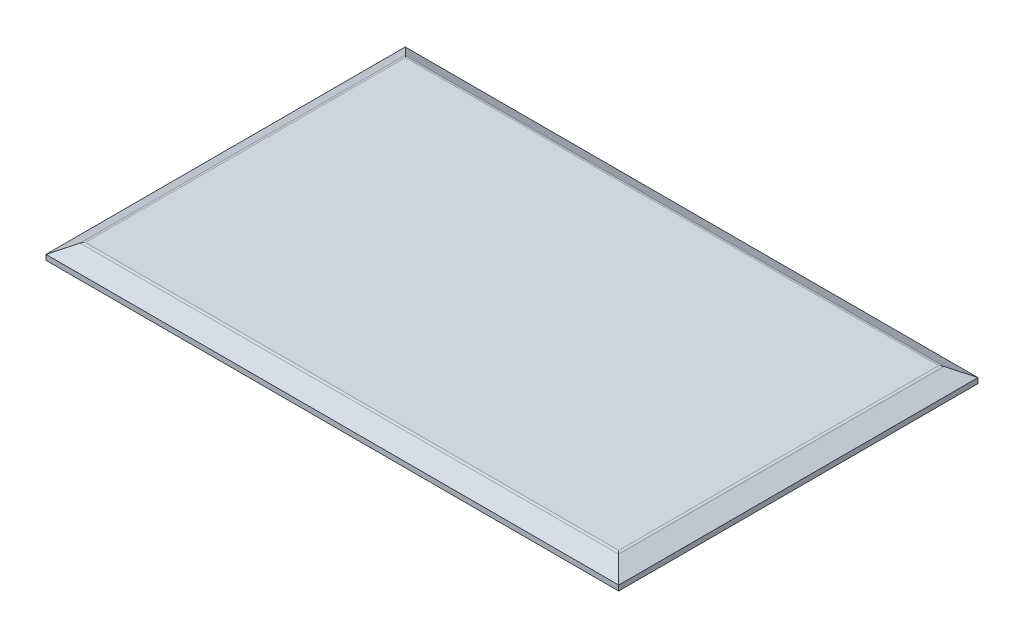
ISO-10303-21;
HEADER;
FILE_DESCRIPTION(('STEP AP214'),'2;1');
FILE_NAME('part.step','',(''),(''),'','','');
FILE_SCHEMA(('AUTOMOTIVE_DESIGN { 1 0 10303 214 1 1 1 1 }'));
ENDSEC;
DATA;
#1=APPLICATION_CONTEXT('core data for automotive mechanical design processes');
#2=APPLICATION_PROTOCOL_DEFINITION('international standard','automotive_design',2000,#1);
#3=PRODUCT_CONTEXT('',#1,'mechanical');
#4=PRODUCT('Part','Part','',(#3));
#5=PRODUCT_RELATED_PRODUCT_CATEGORY('part','',(#4));
#6=PRODUCT_DEFINITION_FORMATION('','',#4);
#7=PRODUCT_DEFINITION_CONTEXT('part definition',#1,'design');
#8=PRODUCT_DEFINITION('design','',#6,#7);
#9=PRODUCT_DEFINITION_SHAPE('','',#8);
#10=(LENGTH_UNIT() NAMED_UNIT(*) SI_UNIT(.MILLI.,.METRE.));
#11=(NAMED_UNIT(*) PLANE_ANGLE_UNIT() SI_UNIT($,.RADIAN.));
#12=(NAMED_UNIT(*) SI_UNIT($,.STERADIAN.) SOLID_ANGLE_UNIT());
#13=UNCERTAINTY_MEASURE_WITH_UNIT(LENGTH_MEASURE(1.E-05),#10,'distance_accuracy_value','');
#14=(GEOMETRIC_REPRESENTATION_CONTEXT(3) GLOBAL_UNCERTAINTY_ASSIGNED_CONTEXT((#13)) GLOBAL_UNIT_ASSIGNED_CONTEXT((#10,
#11,#12)) REPRESENTATION_CONTEXT('',''));
#15=CARTESIAN_POINT('',(0.,0.,0.));
#16=DIRECTION('',(0.,0.,1.));
#17=DIRECTION('',(1.,0.,0.));
#18=AXIS2_PLACEMENT_3D('',#15,#16,#17);
#19=CARTESIAN_POINT('',(55.,3.,-34.5));
#20=DIRECTION('',(-1.,0.,0.));
#21=DIRECTION('',(0.,0.,1.));
#22=AXIS2_PLACEMENT_3D('',#19,#20,#21);
#23=PLANE('',#22);
#24=DIRECTION('',(0.,-1.,0.));
#25=VECTOR('',#24,1.);
#26=CARTESIAN_POINT('',(55.,3.,-34.5));
#27=LINE('',#26,#25);
#28=CARTESIAN_POINT('',(55.,0.999999999999999,-34.5));
#29=VERTEX_POINT('',#28);
#30=CARTESIAN_POINT('',(55.,0.,-34.5));
#31=VERTEX_POINT('',#30);
#32=EDGE_CURVE('E106',#29,#31,#27,.T.);
#33=ORIENTED_EDGE('',*,*,#32,.F.);
#34=DIRECTION('',(0.,0.,1.));
#35=VECTOR('',#34,1.);
#36=CARTESIAN_POINT('',(55.,0.999999999999999,34.5));
#37=LINE('',#36,#35);
#38=CARTESIAN_POINT('',(55.,0.999999999999999,34.5));
#39=VERTEX_POINT('',#38);
#40=EDGE_CURVE('E152',#29,#39,#37,.T.);
#41=ORIENTED_EDGE('',*,*,#40,.T.);
#42=DIRECTION('',(0.,-1.,0.));
#43=VECTOR('',#42,1.);
#44=CARTESIAN_POINT('',(55.,3.,34.5));
#45=LINE('',#44,#43);
#46=CARTESIAN_POINT('',(55.,0.,34.5));
#47=VERTEX_POINT('',#46);
#48=EDGE_CURVE('E129',#39,#47,#45,.T.);
#49=ORIENTED_EDGE('',*,*,#48,.T.);
#50=DIRECTION('',(0.,0.,-1.));
#51=VECTOR('',#50,1.);
#52=CARTESIAN_POINT('',(55.,0.,-34.5));
#53=LINE('',#52,#51);
#54=EDGE_CURVE('E124',#47,#31,#53,.T.);
#55=ORIENTED_EDGE('',*,*,#54,.T.);
#56=EDGE_LOOP('',(#33,#41,#49,#55));
#57=FACE_BOUND('',#56,.T.);
#58=ADVANCED_FACE('F39',(#57),#23,.F.);
#59=CARTESIAN_POINT('',(-55.,3.,-34.5));
#60=DIRECTION('',(0.,0.,1.));
#61=DIRECTION('',(1.,0.,0.));
#62=AXIS2_PLACEMENT_3D('',#59,#60,#61);
#63=PLANE('',#62);
#64=DIRECTION('',(0.,-1.,0.));
#65=VECTOR('',#64,1.);
#66=CARTESIAN_POINT('',(-55.,3.,-34.5));
#67=LINE('',#66,#65);
#68=CARTESIAN_POINT('',(-55.,0.999999999999998,-34.5));
#69=VERTEX_POINT('',#68);
#70=CARTESIAN_POINT('',(-55.,0.,-34.5));
#71=VERTEX_POINT('',#70);
#72=EDGE_CURVE('E118',#69,#71,#67,.T.);
#73=ORIENTED_EDGE('',*,*,#72,.F.);
#74=DIRECTION('',(1.,0.,0.));
#75=VECTOR('',#74,1.);
#76=CARTESIAN_POINT('',(55.,0.999999999999998,-34.5));
#77=LINE('',#76,#75);
#78=EDGE_CURVE('E113',#69,#29,#77,.T.);
#79=ORIENTED_EDGE('',*,*,#78,.T.);
#80=ORIENTED_EDGE('',*,*,#32,.T.);
#81=DIRECTION('',(-1.,0.,0.));
#82=VECTOR('',#81,1.);
#83=CARTESIAN_POINT('',(-55.,0.,-34.5));
#84=LINE('',#83,#82);
#85=EDGE_CURVE('E110',#31,#71,#84,.T.);
#86=ORIENTED_EDGE('',*,*,#85,.T.);
#87=EDGE_LOOP('',(#73,#79,#80,#86));
#88=FACE_BOUND('',#87,.T.);
#89=ADVANCED_FACE('F109',(#88),#63,.F.);
#90=CARTESIAN_POINT('',(-55.,3.,-34.5));
#91=DIRECTION('',(1.,0.,0.));
#92=DIRECTION('',(0.,0.,-1.));
#93=AXIS2_PLACEMENT_3D('',#90,#91,#92);
#94=PLANE('',#93);
#95=DIRECTION('',(0.,-1.,0.));
#96=VECTOR('',#95,1.);
#97=CARTESIAN_POINT('',(-55.,3.,34.5));
#98=LINE('',#97,#96);
#99=CARTESIAN_POINT('',(-55.,0.999999999999998,34.5));
#100=VERTEX_POINT('',#99);
#101=CARTESIAN_POINT('',(-55.,0.,34.5));
#102=VERTEX_POINT('',#101);
#103=EDGE_CURVE('E143',#100,#102,#98,.T.);
#104=ORIENTED_EDGE('',*,*,#103,.F.);
#105=DIRECTION('',(0.,0.,-1.));
#106=VECTOR('',#105,1.);
#107=CARTESIAN_POINT('',(-55.,0.999999999999998,-34.5));
#108=LINE('',#107,#106);
#109=EDGE_CURVE('E148',#100,#69,#108,.T.);
#110=ORIENTED_EDGE('',*,*,#109,.T.);
#111=ORIENTED_EDGE('',*,*,#72,.T.);
#112=DIRECTION('',(0.,0.,1.));
#113=VECTOR('',#112,1.);
#114=CARTESIAN_POINT('',(-55.,0.,-34.5));
#115=LINE('',#114,#113);
#116=EDGE_CURVE('E126',#71,#102,#115,.T.);
#117=ORIENTED_EDGE('',*,*,#116,.T.);
#118=EDGE_LOOP('',(#104,#110,#111,#117));
#119=FACE_BOUND('',#118,.T.);
#120=ADVANCED_FACE('F211',(#119),#94,.F.);
#121=CARTESIAN_POINT('',(-55.,3.,34.5));
#122=DIRECTION('',(0.,0.,-1.));
#123=DIRECTION('',(-1.,0.,0.));
#124=AXIS2_PLACEMENT_3D('',#121,#122,#123);
#125=PLANE('',#124);
#126=ORIENTED_EDGE('',*,*,#48,.F.);
#127=DIRECTION('',(-1.,0.,0.));
#128=VECTOR('',#127,1.);
#129=CARTESIAN_POINT('',(-55.,0.999999999999998,34.5));
#130=LINE('',#129,#128);
#131=EDGE_CURVE('E117',#39,#100,#130,.T.);
#132=ORIENTED_EDGE('',*,*,#131,.T.);
#133=ORIENTED_EDGE('',*,*,#103,.T.);
#134=DIRECTION('',(1.,0.,0.));
#135=VECTOR('',#134,1.);
#136=CARTESIAN_POINT('',(-55.,0.,34.5));
#137=LINE('',#136,#135);
#138=EDGE_CURVE('E140',#102,#47,#137,.T.);
#139=ORIENTED_EDGE('',*,*,#138,.T.);
#140=EDGE_LOOP('',(#126,#132,#133,#139));
#141=FACE_BOUND('',#140,.T.);
#142=ADVANCED_FACE('F201',(#141),#125,.F.);
#143=CARTESIAN_POINT('',(0.,3.,0.));
#144=DIRECTION('',(0.,1.,0.));
#145=DIRECTION('',(0.,0.,1.));
#146=AXIS2_PLACEMENT_3D('',#143,#144,#145);
#147=PLANE('',#146);
#148=DIRECTION('',(0.,0.,-1.));
#149=VECTOR('',#148,1.);
#150=CARTESIAN_POINT('',(51.2344355629253,3.,0.));
#151=LINE('',#150,#149);
#152=CARTESIAN_POINT('',(51.2344355629253,3.,30.7344355629253));
#153=VERTEX_POINT('',#152);
#154=CARTESIAN_POINT('',(51.2344355629253,3.,-30.7344355629253));
#155=VERTEX_POINT('',#154);
#156=EDGE_CURVE('E164',#153,#155,#151,.T.);
#157=ORIENTED_EDGE('',*,*,#156,.T.);
#158=DIRECTION('',(-1.,0.,0.));
#159=VECTOR('',#158,1.);
#160=CARTESIAN_POINT('',(0.,3.,-30.7344355629253));
#161=LINE('',#160,#159);
#162=CARTESIAN_POINT('',(-51.2344355629253,3.,-30.7344355629253));
#163=VERTEX_POINT('',#162);
#164=EDGE_CURVE('E166',#155,#163,#161,.T.);
#165=ORIENTED_EDGE('',*,*,#164,.T.);
#166=DIRECTION('',(0.,0.,1.));
#167=VECTOR('',#166,1.);
#168=CARTESIAN_POINT('',(-51.2344355629253,3.,0.));
#169=LINE('',#168,#167);
#170=CARTESIAN_POINT('',(-51.2344355629253,3.,30.7344355629253));
#171=VERTEX_POINT('',#170);
#172=EDGE_CURVE('E154',#163,#171,#169,.T.);
#173=ORIENTED_EDGE('',*,*,#172,.T.);
#174=DIRECTION('',(1.,0.,0.));
#175=VECTOR('',#174,1.);
#176=CARTESIAN_POINT('',(0.,3.,30.7344355629253));
#177=LINE('',#176,#175);
#178=EDGE_CURVE('E162',#171,#153,#177,.T.);
#179=ORIENTED_EDGE('',*,*,#178,.T.);
#180=EDGE_LOOP('',(#157,#165,#173,#179));
#181=FACE_BOUND('',#180,.T.);
#182=ADVANCED_FACE('F191',(#181),#147,.T.);
#183=CARTESIAN_POINT('',(0.,0.,0.));
#184=DIRECTION('',(0.,1.,0.));
#185=DIRECTION('',(0.,0.,1.));
#186=AXIS2_PLACEMENT_3D('',#183,#184,#185);
#187=PLANE('',#186);
#188=CARTESIAN_POINT('',(44.,0.,-3.50000000000001));
#189=DIRECTION('',(0.,1.,0.));
#190=DIRECTION('',(0.,0.,1.));
#191=AXIS2_PLACEMENT_3D('',#188,#189,#190);
#192=CIRCLE('',#191,1.5);
#193=CARTESIAN_POINT('',(44.,0.,-2.00000000000001));
#194=VERTEX_POINT('',#193);
#195=EDGE_CURVE('E11',#194,#194,#192,.F.);
#196=ORIENTED_EDGE('',*,*,#195,.F.);
#197=EDGE_LOOP('',(#196));
#198=FACE_BOUND('',#197,.T.);
#199=CARTESIAN_POINT('',(44.,0.,3.50000000000001));
#200=DIRECTION('',(0.,1.,0.));
#201=DIRECTION('',(0.,0.,1.));
#202=AXIS2_PLACEMENT_3D('',#199,#200,#201);
#203=CIRCLE('',#202,1.5);
#204=CARTESIAN_POINT('',(44.,0.,5.00000000000001));
#205=VERTEX_POINT('',#204);
#206=EDGE_CURVE('E47',#205,#205,#203,.F.);
#207=ORIENTED_EDGE('',*,*,#206,.F.);
#208=EDGE_LOOP('',(#207));
#209=FACE_BOUND('',#208,.T.);
#210=ORIENTED_EDGE('',*,*,#54,.F.);
#211=ORIENTED_EDGE('',*,*,#138,.F.);
#212=ORIENTED_EDGE('',*,*,#116,.F.);
#213=ORIENTED_EDGE('',*,*,#85,.F.);
#214=EDGE_LOOP('',(#210,#211,#212,#213));
#215=FACE_BOUND('',#214,.T.);
#216=ADVANCED_FACE('F122',(#198,#209,#215),#187,.F.);
#217=CARTESIAN_POINT('',(0.,3.,-31.));
#218=DIRECTION('',(0.,0.868243142124461,-0.496138938356831));
#219=DIRECTION('',(1.,0.,0.));
#220=AXIS2_PLACEMENT_3D('',#217,#218,#219);
#221=PLANE('',#220);
#222=DIRECTION('',(0.655610068107187,0.374634324632675,0.655610068107187));
#223=VECTOR('',#222,1.);
#224=CARTESIAN_POINT('',(-29.3640350877192,15.6491228070175,-8.86403508771923));
#225=LINE('',#224,#223);
#226=CARTESIAN_POINT('',(-51.7305745012822,2.86824314212445,-31.2305745012822));
#227=VERTEX_POINT('',#226);
#228=EDGE_CURVE('E131',#227,#69,#225,.F.);
#229=ORIENTED_EDGE('',*,*,#228,.F.);
#230=DIRECTION('',(-1.,0.,0.));
#231=VECTOR('',#230,1.);
#232=CARTESIAN_POINT('',(0.,2.86824314212446,-31.2305745012822));
#233=LINE('',#232,#231);
#234=CARTESIAN_POINT('',(51.7305745012821,2.86824314212446,-31.2305745012822));
#235=VERTEX_POINT('',#234);
#236=EDGE_CURVE('E169',#227,#235,#233,.F.);
#237=ORIENTED_EDGE('',*,*,#236,.T.);
#238=DIRECTION('',(-0.655610068107187,0.374634324632675,0.655610068107186));
#239=VECTOR('',#238,1.);
#240=CARTESIAN_POINT('',(38.1754385964912,10.6140350877192,-17.6754385964912));
#241=LINE('',#240,#239);
#242=EDGE_CURVE('E133',#29,#235,#241,.T.);
#243=ORIENTED_EDGE('',*,*,#242,.F.);
#244=ORIENTED_EDGE('',*,*,#78,.F.);
#245=EDGE_LOOP('',(#229,#237,#243,#244));
#246=FACE_BOUND('',#245,.T.);
#247=ADVANCED_FACE('F190',(#246),#221,.T.);
#248=CARTESIAN_POINT('',(-51.5,3.,0.));
#249=DIRECTION('',(-0.496138938356831,0.868243142124461,0.));
#250=DIRECTION('',(0.,0.,-1.));
#251=AXIS2_PLACEMENT_3D('',#248,#249,#250);
#252=PLANE('',#251);
#253=DIRECTION('',(0.655610068107187,0.374634324632675,-0.655610068107187));
#254=VECTOR('',#253,1.);
#255=CARTESIAN_POINT('',(-38.1754385964912,10.6140350877192,17.6754385964912));
#256=LINE('',#255,#254);
#257=CARTESIAN_POINT('',(-51.7305745012822,2.86824314212446,31.2305745012822));
#258=VERTEX_POINT('',#257);
#259=EDGE_CURVE('E157',#258,#100,#256,.F.);
#260=ORIENTED_EDGE('',*,*,#259,.F.);
#261=DIRECTION('',(0.,0.,1.));
#262=VECTOR('',#261,1.);
#263=CARTESIAN_POINT('',(-51.7305745012822,2.86824314212446,0.));
#264=LINE('',#263,#262);
#265=EDGE_CURVE('E174',#258,#227,#264,.F.);
#266=ORIENTED_EDGE('',*,*,#265,.T.);
#267=ORIENTED_EDGE('',*,*,#228,.T.);
#268=ORIENTED_EDGE('',*,*,#109,.F.);
#269=EDGE_LOOP('',(#260,#266,#267,#268));
#270=FACE_BOUND('',#269,.T.);
#271=ADVANCED_FACE('F198',(#270),#252,.T.);
#272=CARTESIAN_POINT('',(51.5,3.,0.));
#273=DIRECTION('',(0.49613893835683,0.868243142124461,0.));
#274=DIRECTION('',(0.,0.,1.));
#275=AXIS2_PLACEMENT_3D('',#272,#273,#274);
#276=PLANE('',#275);
#277=ORIENTED_EDGE('',*,*,#242,.T.);
#278=DIRECTION('',(0.,0.,-1.));
#279=VECTOR('',#278,1.);
#280=CARTESIAN_POINT('',(51.7305745012822,2.86824314212446,0.));
#281=LINE('',#280,#279);
#282=CARTESIAN_POINT('',(51.7305745012822,2.86824314212446,31.2305745012822));
#283=VERTEX_POINT('',#282);
#284=EDGE_CURVE('E62',#235,#283,#281,.F.);
#285=ORIENTED_EDGE('',*,*,#284,.T.);
#286=DIRECTION('',(0.655610068107187,-0.374634324632675,0.655610068107186));
#287=VECTOR('',#286,1.);
#288=CARTESIAN_POINT('',(38.1754385964912,10.6140350877192,17.6754385964912));
#289=LINE('',#288,#287);
#290=EDGE_CURVE('E155',#39,#283,#289,.F.);
#291=ORIENTED_EDGE('',*,*,#290,.F.);
#292=ORIENTED_EDGE('',*,*,#40,.F.);
#293=EDGE_LOOP('',(#277,#285,#291,#292));
#294=FACE_BOUND('',#293,.T.);
#295=ADVANCED_FACE('F218',(#294),#276,.T.);
#296=CARTESIAN_POINT('',(0.,3.,31.));
#297=DIRECTION('',(0.,0.868243142124461,0.496138938356831));
#298=DIRECTION('',(-1.,0.,0.));
#299=AXIS2_PLACEMENT_3D('',#296,#297,#298);
#300=PLANE('',#299);
#301=ORIENTED_EDGE('',*,*,#290,.T.);
#302=DIRECTION('',(1.,0.,0.));
#303=VECTOR('',#302,1.);
#304=CARTESIAN_POINT('',(0.,2.86824314212446,31.2305745012822));
#305=LINE('',#304,#303);
#306=EDGE_CURVE('E54',#283,#258,#305,.F.);
#307=ORIENTED_EDGE('',*,*,#306,.T.);
#308=ORIENTED_EDGE('',*,*,#259,.T.);
#309=ORIENTED_EDGE('',*,*,#131,.F.);
#310=EDGE_LOOP('',(#301,#307,#308,#309));
#311=FACE_BOUND('',#310,.T.);
#312=ADVANCED_FACE('F215',(#311),#300,.T.);
#313=CARTESIAN_POINT('',(0.,2.,30.7344355629253));
#314=DIRECTION('',(1.,0.,0.));
#315=DIRECTION('',(0.,0.,-1.));
#316=AXIS2_PLACEMENT_3D('',#313,#314,#315);
#317=CYLINDRICAL_SURFACE('',#316,1.);
#318=CARTESIAN_POINT('',(-51.2344355629253,2.,30.7344355629253));
#319=DIRECTION('',(0.707106781186547,0.,0.707106781186547));
#320=DIRECTION('',(-0.707106781186547,0.,0.707106781186547));
#321=AXIS2_PLACEMENT_3D('',#318,#319,#320);
#322=ELLIPSE('',#321,1.41421356237309,1.);
#323=EDGE_CURVE('E180',#258,#171,#322,.F.);
#324=ORIENTED_EDGE('',*,*,#323,.F.);
#325=ORIENTED_EDGE('',*,*,#306,.F.);
#326=CARTESIAN_POINT('',(51.2344355629253,2.,30.7344355629253));
#327=DIRECTION('',(0.707106781186547,0.,-0.707106781186548));
#328=DIRECTION('',(0.707106781186547,0.,0.707106781186547));
#329=AXIS2_PLACEMENT_3D('',#326,#327,#328);
#330=ELLIPSE('',#329,1.4142135623731,1.);
#331=EDGE_CURVE('E158',#153,#283,#330,.T.);
#332=ORIENTED_EDGE('',*,*,#331,.F.);
#333=ORIENTED_EDGE('',*,*,#178,.F.);
#334=EDGE_LOOP('',(#324,#325,#332,#333));
#335=FACE_BOUND('',#334,.T.);
#336=ADVANCED_FACE('F41',(#335),#317,.T.);
#337=CARTESIAN_POINT('',(51.2344355629253,2.,0.));
#338=DIRECTION('',(0.,0.,-1.));
#339=DIRECTION('',(-1.,0.,0.));
#340=AXIS2_PLACEMENT_3D('',#337,#338,#339);
#341=CYLINDRICAL_SURFACE('',#340,1.);
#342=ORIENTED_EDGE('',*,*,#331,.T.);
#343=ORIENTED_EDGE('',*,*,#284,.F.);
#344=CARTESIAN_POINT('',(51.2344355629253,2.,-30.7344355629253));
#345=DIRECTION('',(-0.707106781186547,0.,-0.707106781186547));
#346=DIRECTION('',(0.707106781186547,0.,-0.707106781186548));
#347=AXIS2_PLACEMENT_3D('',#344,#345,#346);
#348=ELLIPSE('',#347,1.41421356237309,1.);
#349=EDGE_CURVE('E178',#155,#235,#348,.T.);
#350=ORIENTED_EDGE('',*,*,#349,.F.);
#351=ORIENTED_EDGE('',*,*,#156,.F.);
#352=EDGE_LOOP('',(#342,#343,#350,#351));
#353=FACE_BOUND('',#352,.T.);
#354=ADVANCED_FACE('F230',(#353),#341,.T.);
#355=CARTESIAN_POINT('',(-51.2344355629253,2.,0.));
#356=DIRECTION('',(0.,0.,1.));
#357=DIRECTION('',(1.,0.,0.));
#358=AXIS2_PLACEMENT_3D('',#355,#356,#357);
#359=CYLINDRICAL_SURFACE('',#358,1.);
#360=ORIENTED_EDGE('',*,*,#323,.T.);
#361=ORIENTED_EDGE('',*,*,#172,.F.);
#362=CARTESIAN_POINT('',(-51.2344355629253,2.,-30.7344355629253));
#363=DIRECTION('',(-0.707106781186547,0.,0.707106781186547));
#364=DIRECTION('',(0.707106781186547,0.,0.707106781186547));
#365=AXIS2_PLACEMENT_3D('',#362,#363,#364);
#366=ELLIPSE('',#365,1.41421356237309,1.);
#367=EDGE_CURVE('E176',#227,#163,#366,.F.);
#368=ORIENTED_EDGE('',*,*,#367,.F.);
#369=ORIENTED_EDGE('',*,*,#265,.F.);
#370=EDGE_LOOP('',(#360,#361,#368,#369));
#371=FACE_BOUND('',#370,.T.);
#372=ADVANCED_FACE('F227',(#371),#359,.T.);
#373=CARTESIAN_POINT('',(0.,2.,-30.7344355629253));
#374=DIRECTION('',(-1.,0.,0.));
#375=DIRECTION('',(0.,0.,1.));
#376=AXIS2_PLACEMENT_3D('',#373,#374,#375);
#377=CYLINDRICAL_SURFACE('',#376,1.);
#378=ORIENTED_EDGE('',*,*,#349,.T.);
#379=ORIENTED_EDGE('',*,*,#236,.F.);
#380=ORIENTED_EDGE('',*,*,#367,.T.);
#381=ORIENTED_EDGE('',*,*,#164,.F.);
#382=EDGE_LOOP('',(#378,#379,#380,#381));
#383=FACE_BOUND('',#382,.T.);
#384=ADVANCED_FACE('F224',(#383),#377,.T.);
#385=CARTESIAN_POINT('',(44.,-0.5,3.50000000000001));
#386=DIRECTION('',(0.,1.,0.));
#387=DIRECTION('',(0.,0.,1.));
#388=AXIS2_PLACEMENT_3D('',#385,#386,#387);
#389=CYLINDRICAL_SURFACE('',#388,1.5);
#390=CARTESIAN_POINT('',(44.,-0.5,3.50000000000001));
#391=DIRECTION('',(0.,-1.,0.));
#392=DIRECTION('',(0.,0.,-1.));
#393=AXIS2_PLACEMENT_3D('',#390,#391,#392);
#394=CIRCLE('',#393,1.5);
#395=CARTESIAN_POINT('',(44.,-0.5,2.00000000000001));
#396=VERTEX_POINT('',#395);
#397=EDGE_CURVE('E136',#396,#396,#394,.T.);
#398=ORIENTED_EDGE('',*,*,#397,.F.);
#399=EDGE_LOOP('',(#398));
#400=FACE_BOUND('',#399,.T.);
#401=ORIENTED_EDGE('',*,*,#206,.T.);
#402=EDGE_LOOP('',(#401));
#403=FACE_BOUND('',#402,.T.);
#404=ADVANCED_FACE('F187',(#400,#403),#389,.T.);
#405=CARTESIAN_POINT('',(44.,-0.5,3.50000000000001));
#406=DIRECTION('',(0.,-1.,0.));
#407=DIRECTION('',(0.,0.,-1.));
#408=AXIS2_PLACEMENT_3D('',#405,#406,#407);
#409=PLANE('',#408);
#410=ORIENTED_EDGE('',*,*,#397,.T.);
#411=EDGE_LOOP('',(#410));
#412=FACE_BOUND('',#411,.T.);
#413=ADVANCED_FACE('F324',(#412),#409,.T.);
#414=CARTESIAN_POINT('',(44.,-0.5,-3.50000000000001));
#415=DIRECTION('',(0.,1.,0.));
#416=DIRECTION('',(0.,0.,1.));
#417=AXIS2_PLACEMENT_3D('',#414,#415,#416);
#418=CYLINDRICAL_SURFACE('',#417,1.5);
#419=CARTESIAN_POINT('',(44.,-0.5,-3.50000000000001));
#420=DIRECTION('',(0.,-1.,0.));
#421=DIRECTION('',(0.,0.,-1.));
#422=AXIS2_PLACEMENT_3D('',#419,#420,#421);
#423=CIRCLE('',#422,1.5);
#424=CARTESIAN_POINT('',(44.,-0.5,-5.00000000000001));
#425=VERTEX_POINT('',#424);
#426=EDGE_CURVE('E360',#425,#425,#423,.T.);
#427=ORIENTED_EDGE('',*,*,#426,.F.);
#428=EDGE_LOOP('',(#427));
#429=FACE_BOUND('',#428,.T.);
#430=ORIENTED_EDGE('',*,*,#195,.T.);
#431=EDGE_LOOP('',(#430));
#432=FACE_BOUND('',#431,.T.);
#433=ADVANCED_FACE('F334',(#429,#432),#418,.T.);
#434=CARTESIAN_POINT('',(44.,-0.5,-3.50000000000001));
#435=DIRECTION('',(0.,-1.,0.));
#436=DIRECTION('',(0.,0.,-1.));
#437=AXIS2_PLACEMENT_3D('',#434,#435,#436);
#438=PLANE('',#437);
#439=ORIENTED_EDGE('',*,*,#426,.T.);
#440=EDGE_LOOP('',(#439));
#441=FACE_BOUND('',#440,.T.);
#442=ADVANCED_FACE('F344',(#441),#438,.T.);
#443=CLOSED_SHELL('',(#58,#89,#120,#142,#182,#216,#247,#271,#295,#312,#336,#354,#372,#384,#404,
#413,#433,#442));
#444=MANIFOLD_SOLID_BREP('B2',#443);
#445=ADVANCED_BREP_SHAPE_REPRESENTATION('',(#18,#444),#14);
#446=SHAPE_DEFINITION_REPRESENTATION(#9,#445);
ENDSEC;
END-ISO-10303-21;
